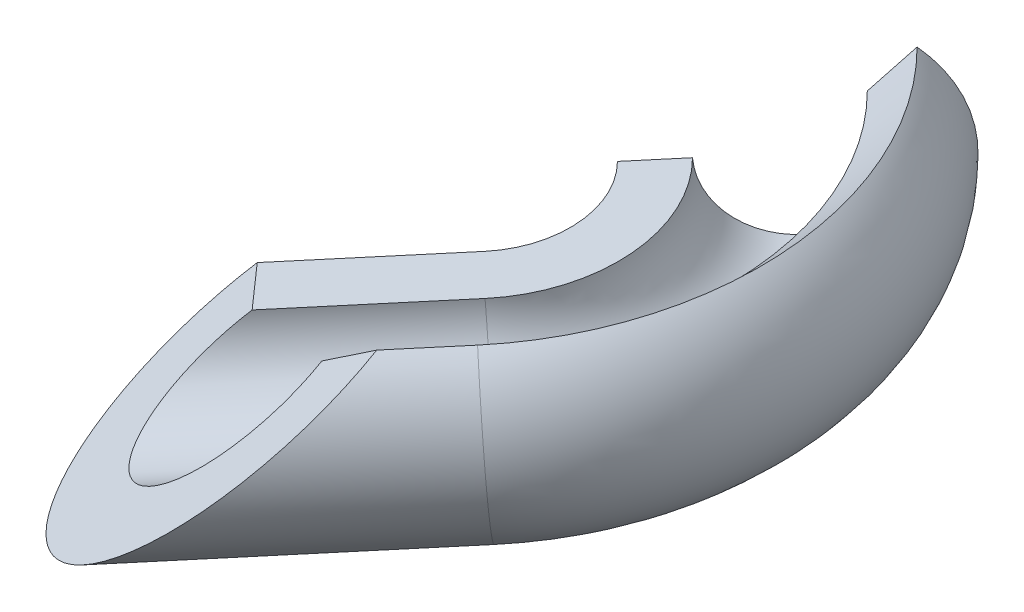
ISO-10303-21;
HEADER;
FILE_DESCRIPTION(('STEP AP214'),'2;1');
FILE_NAME('part.step','',(''),(''),'','','');
FILE_SCHEMA(('AUTOMOTIVE_DESIGN { 1 0 10303 214 1 1 1 1 }'));
ENDSEC;
DATA;
#1=APPLICATION_CONTEXT('core data for automotive mechanical design processes');
#2=APPLICATION_PROTOCOL_DEFINITION('international standard','automotive_design',2000,#1);
#3=PRODUCT_CONTEXT('',#1,'mechanical');
#4=PRODUCT('Part','Part','',(#3));
#5=PRODUCT_RELATED_PRODUCT_CATEGORY('part','',(#4));
#6=PRODUCT_DEFINITION_FORMATION('','',#4);
#7=PRODUCT_DEFINITION_CONTEXT('part definition',#1,'design');
#8=PRODUCT_DEFINITION('design','',#6,#7);
#9=PRODUCT_DEFINITION_SHAPE('','',#8);
#10=(LENGTH_UNIT() NAMED_UNIT(*) SI_UNIT(.MILLI.,.METRE.));
#11=(NAMED_UNIT(*) PLANE_ANGLE_UNIT() SI_UNIT($,.RADIAN.));
#12=(NAMED_UNIT(*) SI_UNIT($,.STERADIAN.) SOLID_ANGLE_UNIT());
#13=UNCERTAINTY_MEASURE_WITH_UNIT(LENGTH_MEASURE(1.E-05),#10,'distance_accuracy_value','');
#14=(GEOMETRIC_REPRESENTATION_CONTEXT(3) GLOBAL_UNCERTAINTY_ASSIGNED_CONTEXT((#13)) GLOBAL_UNIT_ASSIGNED_CONTEXT((#10,
#11,#12)) REPRESENTATION_CONTEXT('',''));
#15=CARTESIAN_POINT('',(0.,0.,0.));
#16=DIRECTION('',(0.,0.,1.));
#17=DIRECTION('',(1.,0.,0.));
#18=AXIS2_PLACEMENT_3D('',#15,#16,#17);
#19=CARTESIAN_POINT('',(-104.243408647261,-1.08246744900953E-12,0.));
#20=DIRECTION('',(0.,-0.996194698091746,-0.0871557427476584));
#21=DIRECTION('',(1.,0.,0.));
#22=AXIS2_PLACEMENT_3D('',#19,#20,#21);
#23=TOROIDAL_SURFACE('',#22,104.243408647261,35.);
#24=CARTESIAN_POINT('',(-30.5321874987824,6.42435622803223,-73.4307276979825));
#25=DIRECTION('',(-0.707106781186549,0.061628416716212,-0.704416026402758));
#26=DIRECTION('',(0.,-0.996194698091746,-0.087155742747651));
#27=AXIS2_PLACEMENT_3D('',#24,#25,#26);
#28=CIRCLE('',#27,35.);
#29=CARTESIAN_POINT('',(-13.0321874987824,32.6041426502127,-88.7071403295207));
#30=VERTEX_POINT('',#29);
#31=CARTESIAN_POINT('',(-55.2809248403115,4.26736164296407,-48.7761667738859));
#32=VERTEX_POINT('',#31);
#33=EDGE_CURVE('E93',#30,#32,#28,.T.);
#34=ORIENTED_EDGE('',*,*,#33,.T.);
#35=CARTESIAN_POINT('',(-104.243408647261,-1.07819749574032E-12,0.));
#36=DIRECTION('',(0.,-0.996194698091746,-0.0871557427476584));
#37=DIRECTION('',(0.,0.0871557427476584,-0.996194698091746));
#38=AXIS2_PLACEMENT_3D('',#35,#36,#37);
#39=CIRCLE('',#38,69.2434086472606);
#40=CARTESIAN_POINT('',(-55.2809248403115,-4.26736164296566,48.7761667738857));
#41=VERTEX_POINT('',#40);
#42=EDGE_CURVE('E108',#41,#32,#39,.F.);
#43=ORIENTED_EDGE('',*,*,#42,.F.);
#44=CARTESIAN_POINT('',(-30.5321874987824,-6.42435622803287,73.4307276979824));
#45=DIRECTION('',(0.707106781186549,0.0616284167162267,-0.704416026402757));
#46=DIRECTION('',(0.,0.996194698091745,0.0871557427476658));
#47=AXIS2_PLACEMENT_3D('',#44,#45,#46);
#48=CIRCLE('',#47,35.);
#49=CARTESIAN_POINT('',(-13.0321874990214,16.7049791976635,93.0211294993883));
#50=VERTEX_POINT('',#49);
#51=EDGE_CURVE('E141',#50,#41,#48,.T.);
#52=ORIENTED_EDGE('',*,*,#51,.F.);
#53=CARTESIAN_POINT('',(-104.243408647261,24.6545609240951,2.15699458506757));
#54=DIRECTION('',(0.,-0.996194698091746,-0.0871557427476584));
#55=DIRECTION('',(0.,0.0871557427476584,-0.996194698091746));
#56=AXIS2_PLACEMENT_3D('',#53,#54,#55);
#57=CIRCLE('',#56,128.99214598879);
#58=EDGE_CURVE('E159',#50,#30,#57,.F.);
#59=ORIENTED_EDGE('',*,*,#58,.T.);
#60=EDGE_LOOP('',(#34,#43,#52,#59));
#61=FACE_BOUND('',#60,.T.);
#62=ADVANCED_FACE('F82',(#61),#23,.F.);
#63=CARTESIAN_POINT('',(-109.714602356881,-5.9240806704608E-13,0.));
#64=DIRECTION('',(0.,-0.996194698091746,-0.0871557427476584));
#65=DIRECTION('',(0.,0.0871557427476584,-0.996194698091746));
#66=AXIS2_PLACEMENT_3D('',#63,#64,#65);
#67=PLANE('',#66);
#68=DIRECTION('',(0.707106781186548,0.0616284167162268,-0.704416026402757));
#69=VECTOR('',#68,1.);
#70=CARTESIAN_POINT('',(-179.024611547957,-11.9709137324942,136.82817007423));
#71=LINE('',#70,#69);
#72=CARTESIAN_POINT('',(-126.572852710286,-7.39944173257532,84.576006014555));
#73=VERTEX_POINT('',#72);
#74=CARTESIAN_POINT('',(-72.9585943699751,-2.72665122506017,31.1657661138168));
#75=VERTEX_POINT('',#74);
#76=EDGE_CURVE('E297',#73,#75,#71,.T.);
#77=ORIENTED_EDGE('',*,*,#76,.F.);
#78=DIRECTION('',(0.656019410450577,-0.0657802754965363,0.751871989415536));
#79=VECTOR('',#78,1.);
#80=CARTESIAN_POINT('',(-161.353511216602,-3.91192099454489,44.7134615719051));
#81=LINE('',#80,#79);
#82=CARTESIAN_POINT('',(-110.1322587639,-9.04797039177593,103.418774811824));
#83=VERTEX_POINT('',#82);
#84=EDGE_CURVE('E299',#73,#83,#81,.T.);
#85=ORIENTED_EDGE('',*,*,#84,.T.);
#86=DIRECTION('',(0.707106781186548,0.0616284167162268,-0.704416026402757));
#87=VECTOR('',#86,1.);
#88=CARTESIAN_POINT('',(-161.346942018294,-13.5116241503995,154.438570734299));
#89=LINE('',#88,#87);
#90=EDGE_CURVE('E302',#83,#41,#89,.T.);
#91=ORIENTED_EDGE('',*,*,#90,.T.);
#92=ORIENTED_EDGE('',*,*,#42,.T.);
#93=DIRECTION('',(-0.707106781186546,-0.0616284167162201,0.70441602640276));
#94=VECTOR('',#93,1.);
#95=CARTESIAN_POINT('',(-55.2809248403115,4.26736164296432,-48.7761667738859));
#96=LINE('',#95,#94);
#97=CARTESIAN_POINT('',(-72.9585943699751,2.72665122505857,-31.1657661138169));
#98=VERTEX_POINT('',#97);
#99=EDGE_CURVE('E153',#32,#98,#96,.T.);
#100=ORIENTED_EDGE('',*,*,#99,.T.);
#101=CARTESIAN_POINT('',(-104.243408647261,-1.07514752911945E-12,0.));
#102=DIRECTION('',(0.,-0.996194698091746,-0.0871557427476584));
#103=DIRECTION('',(0.,0.0871557427476584,-0.996194698091746));
#104=AXIS2_PLACEMENT_3D('',#101,#102,#103);
#105=CIRCLE('',#104,44.2434086472606);
#106=EDGE_CURVE('E148',#75,#98,#105,.F.);
#107=ORIENTED_EDGE('',*,*,#106,.F.);
#108=EDGE_LOOP('',(#77,#85,#91,#92,#100,#107));
#109=FACE_BOUND('',#108,.T.);
#110=ADVANCED_FACE('F207',(#109),#67,.F.);
#111=CARTESIAN_POINT('',(-104.243408647261,-1.08246744900953E-12,0.));
#112=DIRECTION('',(0.,-0.996194698091746,-0.0871557427476584));
#113=DIRECTION('',(1.,0.,0.));
#114=AXIS2_PLACEMENT_3D('',#111,#112,#113);
#115=TOROIDAL_SURFACE('',#114,104.243408647261,60.);
#116=CARTESIAN_POINT('',(-30.5321874987824,6.42435622803223,-73.4307276979825));
#117=DIRECTION('',(0.707106781186549,-0.061628416716212,0.704416026402758));
#118=DIRECTION('',(0.,0.996194698091746,0.087155742747651));
#119=AXIS2_PLACEMENT_3D('',#116,#117,#118);
#120=CIRCLE('',#119,60.);
#121=CARTESIAN_POINT('',(-0.532187499021402,51.3039900942696,-99.6188636375536));
#122=VERTEX_POINT('',#121);
#123=EDGE_CURVE('E146',#98,#122,#120,.T.);
#124=ORIENTED_EDGE('',*,*,#123,.T.);
#125=CARTESIAN_POINT('',(-104.243408647261,42.2649615834903,3.69770500291411));
#126=DIRECTION('',(0.,0.996194698091746,0.0871557427476584));
#127=DIRECTION('',(0.,-0.0871557427476584,0.996194698091746));
#128=AXIS2_PLACEMENT_3D('',#125,#126,#127);
#129=CIRCLE('',#128,146.669815518454);
#130=CARTESIAN_POINT('',(-0.532187499021392,33.2259330733866,107.014273643441));
#131=VERTEX_POINT('',#130);
#132=EDGE_CURVE('E129',#131,#122,#129,.T.);
#133=ORIENTED_EDGE('',*,*,#132,.F.);
#134=CARTESIAN_POINT('',(-30.5321874987824,-6.42435622803287,73.4307276979824));
#135=DIRECTION('',(-0.707106781186549,-0.0616284167162267,0.704416026402757));
#136=DIRECTION('',(0.,-0.996194698091745,-0.0871557427476658));
#137=AXIS2_PLACEMENT_3D('',#134,#135,#136);
#138=CIRCLE('',#137,60.);
#139=EDGE_CURVE('E313',#75,#131,#138,.T.);
#140=ORIENTED_EDGE('',*,*,#139,.F.);
#141=ORIENTED_EDGE('',*,*,#106,.T.);
#142=EDGE_LOOP('',(#124,#133,#140,#141));
#143=FACE_BOUND('',#142,.T.);
#144=ADVANCED_FACE('F150',(#143),#115,.T.);
#145=CARTESIAN_POINT('',(-104.243408647261,18.1675336525657,1.58945323882524));
#146=DIRECTION('',(0.,0.996194698091746,0.0871557427476584));
#147=DIRECTION('',(0.,-0.0871557427476584,0.996194698091746));
#148=AXIS2_PLACEMENT_3D('',#145,#146,#147);
#149=CONICAL_SURFACE('',#148,122.48033932762,0.785398163397464);
#150=DIRECTION('',(-0.5,-0.747993897776583,0.436468932329663));
#151=VECTOR('',#150,1.);
#152=CARTESIAN_POINT('',(-13.0321874987824,32.6041426502126,-88.7071403295207));
#153=LINE('',#152,#151);
#154=EDGE_CURVE('E133',#122,#30,#153,.T.);
#155=ORIENTED_EDGE('',*,*,#154,.T.);
#156=ORIENTED_EDGE('',*,*,#58,.F.);
#157=DIRECTION('',(-0.5,-0.660838155028923,-0.559725765762101));
#158=VECTOR('',#157,1.);
#159=CARTESIAN_POINT('',(-13.0321874987824,16.7049791979794,93.0211294996559));
#160=LINE('',#159,#158);
#161=EDGE_CURVE('E136',#131,#50,#160,.T.);
#162=ORIENTED_EDGE('',*,*,#161,.F.);
#163=ORIENTED_EDGE('',*,*,#132,.T.);
#164=EDGE_LOOP('',(#155,#156,#162,#163));
#165=FACE_BOUND('',#164,.T.);
#166=ADVANCED_FACE('F131',(#165),#149,.F.);
#167=CARTESIAN_POINT('',(-30.5321874987824,6.42435622803223,-73.4307276979825));
#168=DIRECTION('',(-0.707106781186549,0.061628416716212,-0.704416026402758));
#169=DIRECTION('',(0.,0.996194698091746,0.087155742747651));
#170=AXIS2_PLACEMENT_3D('',#167,#168,#169);
#171=PLANE('',#170);
#172=ORIENTED_EDGE('',*,*,#33,.F.);
#173=ORIENTED_EDGE('',*,*,#154,.F.);
#174=ORIENTED_EDGE('',*,*,#123,.F.);
#175=ORIENTED_EDGE('',*,*,#99,.F.);
#176=EDGE_LOOP('',(#172,#173,#174,#175));
#177=FACE_BOUND('',#176,.T.);
#178=ADVANCED_FACE('F84',(#177),#171,.T.);
#179=CARTESIAN_POINT('',(-136.598204676934,-15.6686187355508,179.093131658219));
#180=DIRECTION('',(0.707106781186548,0.0616284167162268,-0.704416026402757));
#181=DIRECTION('',(-0.705757556807951,0.,-0.708453436019949));
#182=AXIS2_PLACEMENT_3D('',#179,#180,#181);
#183=CYLINDRICAL_SURFACE('',#182,59.999999999761);
#184=DIRECTION('',(0.707106781186548,0.0616284167162268,-0.704416026402757));
#185=VECTOR('',#184,1.);
#186=CARTESIAN_POINT('',(-106.598204677004,23.9816705659526,212.676677603854));
#187=LINE('',#186,#185);
#188=CARTESIAN_POINT('',(-24.2881987062915,31.155460271895,130.679886055931));
#189=VERTEX_POINT('',#188);
#190=EDGE_CURVE('E310',#189,#131,#187,.T.);
#191=ORIENTED_EDGE('',*,*,#190,.F.);
#192=CARTESIAN_POINT('',(-87.1154272392002,-11.3559105147476,129.798651127895));
#193=DIRECTION('',(0.492466031006757,-0.717603244564087,-0.492466031006756));
#194=DIRECTION('',(0.509192715387403,0.696449952740276,-0.505648338200048));
#195=AXIS2_PLACEMENT_3D('',#192,#193,#194);
#196=ELLIPSE('',#195,92.1797350734605,59.999999999761);
#197=CARTESIAN_POINT('',(-133.983527664553,-75.5545680741426,176.478454640405));
#198=VERTEX_POINT('',#197);
#199=EDGE_CURVE('E169',#189,#198,#196,.T.);
#200=ORIENTED_EDGE('',*,*,#199,.T.);
#201=CARTESIAN_POINT('',(-134.121701116974,-75.5542263788707,176.339783282301));
#202=DIRECTION('',(0.705832832121617,-0.0017454853658527,0.708376288691268));
#203=VECTOR('',#202,1.);
#204=LINE('',#201,#203);
#205=CARTESIAN_POINT('',(-134.121701116974,-75.5542263788707,176.339783282301));
#206=VERTEX_POINT('',#205);
#207=EDGE_CURVE('E13',#206,#198,#204,.T.);
#208=ORIENTED_EDGE('',*,*,#207,.F.);
#209=EDGE_CURVE('E99',#206,#73,#196,.T.);
#210=ORIENTED_EDGE('',*,*,#209,.T.);
#211=ORIENTED_EDGE('',*,*,#76,.T.);
#212=ORIENTED_EDGE('',*,*,#139,.T.);
#213=EDGE_LOOP('',(#191,#200,#208,#210,#211,#212));
#214=FACE_BOUND('',#213,.T.);
#215=ADVANCED_FACE('F164',(#214),#183,.T.);
#216=CARTESIAN_POINT('',(-119.098204677004,7.46071669022951,198.683533459802));
#217=DIRECTION('',(0.499999999999999,-0.747993897776593,0.436468932329646));
#218=DIRECTION('',(0.831363597073848,0.555728863260162,0.));
#219=AXIS2_PLACEMENT_3D('',#216,#217,#218);
#220=PLANE('',#219);
#221=DIRECTION('',(0.707106781186548,0.0616284167162268,-0.704416026402757));
#222=VECTOR('',#221,1.);
#223=CARTESIAN_POINT('',(-119.098204677004,7.4607166902295,198.683533459802));
#224=LINE('',#223,#222);
#225=CARTESIAN_POINT('',(-50.4662105951125,13.4423891106903,130.312704835958));
#226=VERTEX_POINT('',#225);
#227=EDGE_CURVE('E304',#226,#50,#224,.T.);
#228=ORIENTED_EDGE('',*,*,#227,.F.);
#229=DIRECTION('',(0.828162687532774,0.560367406036166,0.011616076394034));
#230=VECTOR('',#229,1.);
#231=CARTESIAN_POINT('',(-99.6559190665518,-19.8412998972436,129.622754153554));
#232=LINE('',#231,#230);
#233=EDGE_CURVE('E179',#226,#189,#232,.T.);
#234=ORIENTED_EDGE('',*,*,#233,.T.);
#235=ORIENTED_EDGE('',*,*,#190,.T.);
#236=ORIENTED_EDGE('',*,*,#161,.T.);
#237=EDGE_LOOP('',(#228,#234,#235,#236));
#238=FACE_BOUND('',#237,.T.);
#239=ADVANCED_FACE('F198',(#238),#220,.F.);
#240=CARTESIAN_POINT('',(-136.598204676934,-15.6686187355508,179.093131658219));
#241=DIRECTION('',(0.707106781186548,0.0616284167162268,-0.704416026402757));
#242=DIRECTION('',(-0.705757556807951,0.,-0.708453436019949));
#243=AXIS2_PLACEMENT_3D('',#240,#241,#242);
#244=CYLINDRICAL_SURFACE('',#243,34.999999999761);
#245=ORIENTED_EDGE('',*,*,#90,.F.);
#246=CARTESIAN_POINT('',(-87.1154272392002,-11.3559105147476,129.798651127895));
#247=DIRECTION('',(0.492466031006757,-0.717603244564087,-0.492466031006756));
#248=DIRECTION('',(0.509192715387403,0.696449952740276,-0.505648338200048));
#249=AXIS2_PLACEMENT_3D('',#246,#247,#248);
#250=ELLIPSE('',#249,53.7715121260323,34.999999999761);
#251=EDGE_CURVE('E306',#83,#226,#250,.F.);
#252=ORIENTED_EDGE('',*,*,#251,.T.);
#253=ORIENTED_EDGE('',*,*,#227,.T.);
#254=ORIENTED_EDGE('',*,*,#51,.T.);
#255=EDGE_LOOP('',(#245,#252,#253,#254));
#256=FACE_BOUND('',#255,.T.);
#257=ADVANCED_FACE('F195',(#256),#244,.F.);
#258=CARTESIAN_POINT('',(-302.752280842792,-75.554568074146,7.7097014621704));
#259=DIRECTION('',(0.492466031006757,-0.717603244564087,-0.492466031006756));
#260=DIRECTION('',(0.824516989157638,0.565837197955758,0.));
#261=AXIS2_PLACEMENT_3D('',#258,#259,#260);
#262=PLANE('',#261);
#263=ORIENTED_EDGE('',*,*,#251,.F.);
#264=ORIENTED_EDGE('',*,*,#84,.F.);
#265=ORIENTED_EDGE('',*,*,#209,.F.);
#266=ORIENTED_EDGE('',*,*,#207,.T.);
#267=ORIENTED_EDGE('',*,*,#199,.F.);
#268=ORIENTED_EDGE('',*,*,#233,.F.);
#269=EDGE_LOOP('',(#263,#264,#265,#266,#267,#268));
#270=FACE_BOUND('',#269,.T.);
#271=ADVANCED_FACE('F172',(#270),#262,.F.);
#272=CLOSED_SHELL('',(#62,#110,#144,#166,#178,#215,#239,#257,#271));
#273=MANIFOLD_SOLID_BREP('B2',#272);
#274=ADVANCED_BREP_SHAPE_REPRESENTATION('',(#18,#273),#14);
#275=SHAPE_DEFINITION_REPRESENTATION(#9,#274);
ENDSEC;
END-ISO-10303-21;
